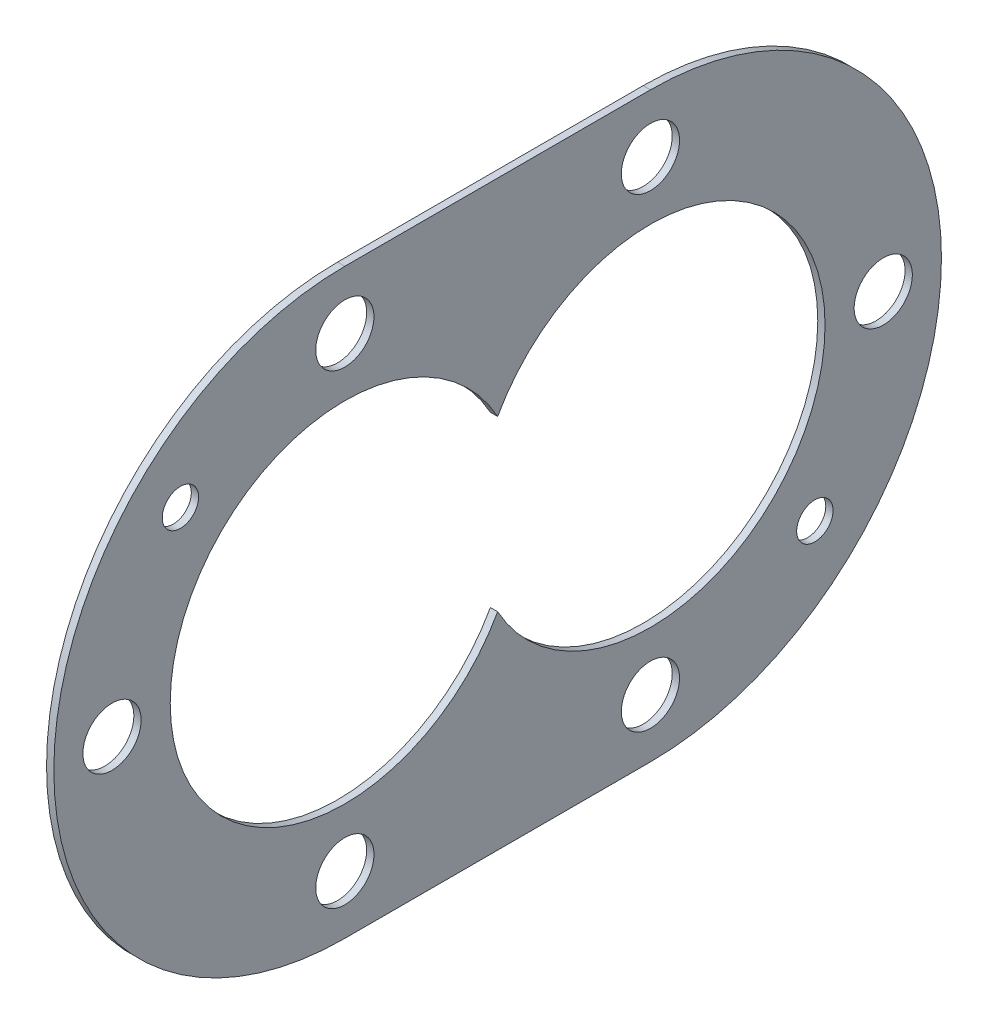
ISO-10303-21;
HEADER;
FILE_DESCRIPTION(('STEP AP214'),'2;1');
FILE_NAME('part.step','',(''),(''),'','','');
FILE_SCHEMA(('AUTOMOTIVE_DESIGN { 1 0 10303 214 1 1 1 1 }'));
ENDSEC;
DATA;
#1=APPLICATION_CONTEXT('core data for automotive mechanical design processes');
#2=APPLICATION_PROTOCOL_DEFINITION('international standard','automotive_design',2000,#1);
#3=PRODUCT_CONTEXT('',#1,'mechanical');
#4=PRODUCT('Part','Part','',(#3));
#5=PRODUCT_RELATED_PRODUCT_CATEGORY('part','',(#4));
#6=PRODUCT_DEFINITION_FORMATION('','',#4);
#7=PRODUCT_DEFINITION_CONTEXT('part definition',#1,'design');
#8=PRODUCT_DEFINITION('design','',#6,#7);
#9=PRODUCT_DEFINITION_SHAPE('','',#8);
#10=(LENGTH_UNIT() NAMED_UNIT(*) SI_UNIT(.MILLI.,.METRE.));
#11=(NAMED_UNIT(*) PLANE_ANGLE_UNIT() SI_UNIT($,.RADIAN.));
#12=(NAMED_UNIT(*) SI_UNIT($,.STERADIAN.) SOLID_ANGLE_UNIT());
#13=UNCERTAINTY_MEASURE_WITH_UNIT(LENGTH_MEASURE(1.E-05),#10,'distance_accuracy_value','');
#14=(GEOMETRIC_REPRESENTATION_CONTEXT(3) GLOBAL_UNCERTAINTY_ASSIGNED_CONTEXT((#13)) GLOBAL_UNIT_ASSIGNED_CONTEXT((#10,
#11,#12)) REPRESENTATION_CONTEXT('',''));
#15=CARTESIAN_POINT('',(0.,0.,0.));
#16=DIRECTION('',(0.,0.,1.));
#17=DIRECTION('',(1.,0.,0.));
#18=AXIS2_PLACEMENT_3D('',#15,#16,#17);
#19=CARTESIAN_POINT('',(-29.,0.,104.));
#20=DIRECTION('',(-1.,0.,0.));
#21=DIRECTION('',(0.,0.,1.));
#22=AXIS2_PLACEMENT_3D('',#19,#20,#21);
#23=CYLINDRICAL_SURFACE('',#22,24.);
#24=CARTESIAN_POINT('',(-30.,0.,104.));
#25=DIRECTION('',(1.,0.,0.));
#26=DIRECTION('',(0.,0.,-1.));
#27=AXIS2_PLACEMENT_3D('',#24,#25,#26);
#28=CIRCLE('',#27,24.);
#29=CARTESIAN_POINT('',(-30.,-11.6189500386223,83.));
#30=VERTEX_POINT('',#29);
#31=CARTESIAN_POINT('',(-30.,11.6189500386223,83.));
#32=VERTEX_POINT('',#31);
#33=EDGE_CURVE('E117',#30,#32,#28,.F.);
#34=ORIENTED_EDGE('',*,*,#33,.F.);
#35=DIRECTION('',(-1.,0.,0.));
#36=VECTOR('',#35,1.);
#37=CARTESIAN_POINT('',(-30.5,-11.6189500386223,83.));
#38=LINE('',#37,#36);
#39=CARTESIAN_POINT('',(-31.,-11.6189500386223,83.));
#40=VERTEX_POINT('',#39);
#41=EDGE_CURVE('E11',#30,#40,#38,.T.);
#42=ORIENTED_EDGE('',*,*,#41,.T.);
#43=CARTESIAN_POINT('',(-31.,0.,104.));
#44=DIRECTION('',(1.,0.,0.));
#45=DIRECTION('',(0.,0.,-1.));
#46=AXIS2_PLACEMENT_3D('',#43,#44,#45);
#47=CIRCLE('',#46,24.);
#48=CARTESIAN_POINT('',(-31.,11.6189500386223,83.));
#49=VERTEX_POINT('',#48);
#50=EDGE_CURVE('E114',#40,#49,#47,.F.);
#51=ORIENTED_EDGE('',*,*,#50,.T.);
#52=DIRECTION('',(-1.,0.,0.));
#53=VECTOR('',#52,1.);
#54=CARTESIAN_POINT('',(-30.5,11.6189500386223,83.));
#55=LINE('',#54,#53);
#56=EDGE_CURVE('E48',#49,#32,#55,.F.);
#57=ORIENTED_EDGE('',*,*,#56,.T.);
#58=EDGE_LOOP('',(#34,#42,#51,#57));
#59=FACE_BOUND('',#58,.T.);
#60=ADVANCED_FACE('F39',(#59),#23,.F.);
#61=CARTESIAN_POINT('',(-30.,0.,104.));
#62=DIRECTION('',(-1.,0.,0.));
#63=DIRECTION('',(0.,0.,1.));
#64=AXIS2_PLACEMENT_3D('',#61,#62,#63);
#65=CYLINDRICAL_SURFACE('',#64,40.);
#66=CARTESIAN_POINT('',(-31.,0.,104.));
#67=DIRECTION('',(1.,0.,0.));
#68=DIRECTION('',(0.,0.,-1.));
#69=AXIS2_PLACEMENT_3D('',#66,#67,#68);
#70=CIRCLE('',#69,40.);
#71=CARTESIAN_POINT('',(-31.,40.,104.));
#72=VERTEX_POINT('',#71);
#73=CARTESIAN_POINT('',(-31.,-40.,104.));
#74=VERTEX_POINT('',#73);
#75=EDGE_CURVE('E119',#72,#74,#70,.T.);
#76=ORIENTED_EDGE('',*,*,#75,.T.);
#77=DIRECTION('',(-1.,0.,0.));
#78=VECTOR('',#77,1.);
#79=CARTESIAN_POINT('',(-30.,-40.,104.));
#80=LINE('',#79,#78);
#81=CARTESIAN_POINT('',(-30.,-40.,104.));
#82=VERTEX_POINT('',#81);
#83=EDGE_CURVE('E108',#82,#74,#80,.T.);
#84=ORIENTED_EDGE('',*,*,#83,.F.);
#85=CARTESIAN_POINT('',(-30.,0.,104.));
#86=DIRECTION('',(1.,0.,0.));
#87=DIRECTION('',(0.,0.,-1.));
#88=AXIS2_PLACEMENT_3D('',#85,#86,#87);
#89=CIRCLE('',#88,40.);
#90=CARTESIAN_POINT('',(-30.,40.,104.));
#91=VERTEX_POINT('',#90);
#92=EDGE_CURVE('E173',#91,#82,#89,.T.);
#93=ORIENTED_EDGE('',*,*,#92,.F.);
#94=DIRECTION('',(-1.,0.,0.));
#95=VECTOR('',#94,1.);
#96=CARTESIAN_POINT('',(-30.,40.,104.));
#97=LINE('',#96,#95);
#98=EDGE_CURVE('E179',#91,#72,#97,.T.);
#99=ORIENTED_EDGE('',*,*,#98,.T.);
#100=EDGE_LOOP('',(#76,#84,#93,#99));
#101=FACE_BOUND('',#100,.T.);
#102=ADVANCED_FACE('F41',(#101),#65,.T.);
#103=CARTESIAN_POINT('',(-30.,-40.,104.));
#104=DIRECTION('',(0.,1.,0.));
#105=DIRECTION('',(0.,0.,1.));
#106=AXIS2_PLACEMENT_3D('',#103,#104,#105);
#107=PLANE('',#106);
#108=DIRECTION('',(0.,0.,-1.));
#109=VECTOR('',#108,1.);
#110=CARTESIAN_POINT('',(-31.,-40.,104.));
#111=LINE('',#110,#109);
#112=CARTESIAN_POINT('',(-31.,-40.,62.));
#113=VERTEX_POINT('',#112);
#114=EDGE_CURVE('E182',#74,#113,#111,.T.);
#115=ORIENTED_EDGE('',*,*,#114,.T.);
#116=DIRECTION('',(-1.,0.,0.));
#117=VECTOR('',#116,1.);
#118=CARTESIAN_POINT('',(-30.,-40.,62.));
#119=LINE('',#118,#117);
#120=CARTESIAN_POINT('',(-30.,-40.,62.));
#121=VERTEX_POINT('',#120);
#122=EDGE_CURVE('E189',#121,#113,#119,.T.);
#123=ORIENTED_EDGE('',*,*,#122,.F.);
#124=DIRECTION('',(0.,0.,-1.));
#125=VECTOR('',#124,1.);
#126=CARTESIAN_POINT('',(-30.,-40.,104.));
#127=LINE('',#126,#125);
#128=EDGE_CURVE('E94',#82,#121,#127,.T.);
#129=ORIENTED_EDGE('',*,*,#128,.F.);
#130=ORIENTED_EDGE('',*,*,#83,.T.);
#131=EDGE_LOOP('',(#115,#123,#129,#130));
#132=FACE_BOUND('',#131,.T.);
#133=ADVANCED_FACE('F195',(#132),#107,.F.);
#134=CARTESIAN_POINT('',(-30.,0.,62.));
#135=DIRECTION('',(-1.,0.,0.));
#136=DIRECTION('',(0.,0.,1.));
#137=AXIS2_PLACEMENT_3D('',#134,#135,#136);
#138=CYLINDRICAL_SURFACE('',#137,40.);
#139=CARTESIAN_POINT('',(-31.,0.,62.));
#140=DIRECTION('',(1.,0.,0.));
#141=DIRECTION('',(0.,0.,-1.));
#142=AXIS2_PLACEMENT_3D('',#139,#140,#141);
#143=CIRCLE('',#142,40.);
#144=CARTESIAN_POINT('',(-31.,40.,62.));
#145=VERTEX_POINT('',#144);
#146=EDGE_CURVE('E184',#113,#145,#143,.T.);
#147=ORIENTED_EDGE('',*,*,#146,.T.);
#148=DIRECTION('',(-1.,0.,0.));
#149=VECTOR('',#148,1.);
#150=CARTESIAN_POINT('',(-30.,40.,62.));
#151=LINE('',#150,#149);
#152=CARTESIAN_POINT('',(-30.,40.,62.));
#153=VERTEX_POINT('',#152);
#154=EDGE_CURVE('E188',#153,#145,#151,.T.);
#155=ORIENTED_EDGE('',*,*,#154,.F.);
#156=CARTESIAN_POINT('',(-30.,0.,62.));
#157=DIRECTION('',(1.,0.,0.));
#158=DIRECTION('',(0.,0.,-1.));
#159=AXIS2_PLACEMENT_3D('',#156,#157,#158);
#160=CIRCLE('',#159,40.);
#161=EDGE_CURVE('E176',#121,#153,#160,.T.);
#162=ORIENTED_EDGE('',*,*,#161,.F.);
#163=ORIENTED_EDGE('',*,*,#122,.T.);
#164=EDGE_LOOP('',(#147,#155,#162,#163));
#165=FACE_BOUND('',#164,.T.);
#166=ADVANCED_FACE('F200',(#165),#138,.T.);
#167=CARTESIAN_POINT('',(-30.,40.,62.));
#168=DIRECTION('',(0.,-1.,0.));
#169=DIRECTION('',(0.,0.,-1.));
#170=AXIS2_PLACEMENT_3D('',#167,#168,#169);
#171=PLANE('',#170);
#172=DIRECTION('',(0.,0.,1.));
#173=VECTOR('',#172,1.);
#174=CARTESIAN_POINT('',(-31.,40.,62.));
#175=LINE('',#174,#173);
#176=EDGE_CURVE('E86',#145,#72,#175,.T.);
#177=ORIENTED_EDGE('',*,*,#176,.T.);
#178=ORIENTED_EDGE('',*,*,#98,.F.);
#179=DIRECTION('',(0.,0.,1.));
#180=VECTOR('',#179,1.);
#181=CARTESIAN_POINT('',(-30.,40.,62.));
#182=LINE('',#181,#180);
#183=EDGE_CURVE('E65',#153,#91,#182,.T.);
#184=ORIENTED_EDGE('',*,*,#183,.F.);
#185=ORIENTED_EDGE('',*,*,#154,.T.);
#186=EDGE_LOOP('',(#177,#178,#184,#185));
#187=FACE_BOUND('',#186,.T.);
#188=ADVANCED_FACE('F201',(#187),#171,.F.);
#189=CARTESIAN_POINT('',(-30.,0.,104.));
#190=DIRECTION('',(1.,0.,0.));
#191=DIRECTION('',(0.,0.,-1.));
#192=AXIS2_PLACEMENT_3D('',#189,#190,#191);
#193=PLANE('',#192);
#194=CARTESIAN_POINT('',(-30.,-22.6,39.4));
#195=DIRECTION('',(1.,0.,0.));
#196=DIRECTION('',(0.,0.,-1.));
#197=AXIS2_PLACEMENT_3D('',#194,#195,#196);
#198=CIRCLE('',#197,2.5);
#199=CARTESIAN_POINT('',(-30.,-22.6,36.9));
#200=VERTEX_POINT('',#199);
#201=EDGE_CURVE('E150',#200,#200,#198,.F.);
#202=ORIENTED_EDGE('',*,*,#201,.T.);
#203=EDGE_LOOP('',(#202));
#204=FACE_BOUND('',#203,.T.);
#205=CARTESIAN_POINT('',(-30.,22.6,126.6));
#206=DIRECTION('',(1.,0.,0.));
#207=DIRECTION('',(0.,0.,-1.));
#208=AXIS2_PLACEMENT_3D('',#205,#206,#207);
#209=CIRCLE('',#208,2.5);
#210=CARTESIAN_POINT('',(-30.,22.6,124.1));
#211=VERTEX_POINT('',#210);
#212=EDGE_CURVE('E147',#211,#211,#209,.F.);
#213=ORIENTED_EDGE('',*,*,#212,.T.);
#214=EDGE_LOOP('',(#213));
#215=FACE_BOUND('',#214,.T.);
#216=CARTESIAN_POINT('',(-30.,0.,30.));
#217=DIRECTION('',(1.,0.,0.));
#218=DIRECTION('',(0.,0.,-1.));
#219=AXIS2_PLACEMENT_3D('',#216,#217,#218);
#220=CIRCLE('',#219,4.);
#221=CARTESIAN_POINT('',(-30.,0.,26.));
#222=VERTEX_POINT('',#221);
#223=EDGE_CURVE('E144',#222,#222,#220,.F.);
#224=ORIENTED_EDGE('',*,*,#223,.T.);
#225=EDGE_LOOP('',(#224));
#226=FACE_BOUND('',#225,.T.);
#227=CARTESIAN_POINT('',(-30.,0.,136.));
#228=DIRECTION('',(1.,0.,0.));
#229=DIRECTION('',(0.,0.,-1.));
#230=AXIS2_PLACEMENT_3D('',#227,#228,#229);
#231=CIRCLE('',#230,4.);
#232=CARTESIAN_POINT('',(-30.,0.,132.));
#233=VERTEX_POINT('',#232);
#234=EDGE_CURVE('E140',#233,#233,#231,.F.);
#235=ORIENTED_EDGE('',*,*,#234,.T.);
#236=EDGE_LOOP('',(#235));
#237=FACE_BOUND('',#236,.T.);
#238=CARTESIAN_POINT('',(-30.,-32.,62.));
#239=DIRECTION('',(1.,0.,0.));
#240=DIRECTION('',(0.,0.,-1.));
#241=AXIS2_PLACEMENT_3D('',#238,#239,#240);
#242=CIRCLE('',#241,4.);
#243=CARTESIAN_POINT('',(-30.,-32.,58.));
#244=VERTEX_POINT('',#243);
#245=EDGE_CURVE('E136',#244,#244,#242,.F.);
#246=ORIENTED_EDGE('',*,*,#245,.T.);
#247=EDGE_LOOP('',(#246));
#248=FACE_BOUND('',#247,.T.);
#249=CARTESIAN_POINT('',(-30.,32.,62.));
#250=DIRECTION('',(1.,0.,0.));
#251=DIRECTION('',(0.,0.,-1.));
#252=AXIS2_PLACEMENT_3D('',#249,#250,#251);
#253=CIRCLE('',#252,4.);
#254=CARTESIAN_POINT('',(-30.,32.,58.));
#255=VERTEX_POINT('',#254);
#256=EDGE_CURVE('E132',#255,#255,#253,.F.);
#257=ORIENTED_EDGE('',*,*,#256,.T.);
#258=EDGE_LOOP('',(#257));
#259=FACE_BOUND('',#258,.T.);
#260=CARTESIAN_POINT('',(-30.,-32.,104.));
#261=DIRECTION('',(1.,0.,0.));
#262=DIRECTION('',(0.,0.,-1.));
#263=AXIS2_PLACEMENT_3D('',#260,#261,#262);
#264=CIRCLE('',#263,4.);
#265=CARTESIAN_POINT('',(-30.,-32.,100.));
#266=VERTEX_POINT('',#265);
#267=EDGE_CURVE('E128',#266,#266,#264,.F.);
#268=ORIENTED_EDGE('',*,*,#267,.T.);
#269=EDGE_LOOP('',(#268));
#270=FACE_BOUND('',#269,.T.);
#271=CARTESIAN_POINT('',(-30.,32.,104.));
#272=DIRECTION('',(1.,0.,0.));
#273=DIRECTION('',(0.,0.,-1.));
#274=AXIS2_PLACEMENT_3D('',#271,#272,#273);
#275=CIRCLE('',#274,4.);
#276=CARTESIAN_POINT('',(-30.,32.,100.));
#277=VERTEX_POINT('',#276);
#278=EDGE_CURVE('E115',#277,#277,#275,.F.);
#279=ORIENTED_EDGE('',*,*,#278,.T.);
#280=EDGE_LOOP('',(#279));
#281=FACE_BOUND('',#280,.T.);
#282=ORIENTED_EDGE('',*,*,#33,.T.);
#283=CARTESIAN_POINT('',(-30.,0.,62.));
#284=DIRECTION('',(1.,0.,0.));
#285=DIRECTION('',(0.,0.,-1.));
#286=AXIS2_PLACEMENT_3D('',#283,#284,#285);
#287=CIRCLE('',#286,24.);
#288=EDGE_CURVE('E56',#32,#30,#287,.F.);
#289=ORIENTED_EDGE('',*,*,#288,.T.);
#290=EDGE_LOOP('',(#282,#289));
#291=FACE_BOUND('',#290,.T.);
#292=ORIENTED_EDGE('',*,*,#92,.T.);
#293=ORIENTED_EDGE('',*,*,#128,.T.);
#294=ORIENTED_EDGE('',*,*,#161,.T.);
#295=ORIENTED_EDGE('',*,*,#183,.T.);
#296=EDGE_LOOP('',(#292,#293,#294,#295));
#297=FACE_BOUND('',#296,.T.);
#298=ADVANCED_FACE('F202',(#204,#215,#226,#237,#248,#259,#270,#281,#291,#297),#193,.T.);
#299=CARTESIAN_POINT('',(-31.,0.,104.));
#300=DIRECTION('',(1.,0.,0.));
#301=DIRECTION('',(0.,0.,-1.));
#302=AXIS2_PLACEMENT_3D('',#299,#300,#301);
#303=PLANE('',#302);
#304=CARTESIAN_POINT('',(-31.,-22.6,39.4));
#305=DIRECTION('',(1.,0.,0.));
#306=DIRECTION('',(0.,0.,-1.));
#307=AXIS2_PLACEMENT_3D('',#304,#305,#306);
#308=CIRCLE('',#307,2.5);
#309=CARTESIAN_POINT('',(-31.,-22.6,36.9));
#310=VERTEX_POINT('',#309);
#311=EDGE_CURVE('E43',#310,#310,#308,.F.);
#312=ORIENTED_EDGE('',*,*,#311,.F.);
#313=EDGE_LOOP('',(#312));
#314=FACE_BOUND('',#313,.T.);
#315=CARTESIAN_POINT('',(-31.,22.6,126.6));
#316=DIRECTION('',(1.,0.,0.));
#317=DIRECTION('',(0.,0.,-1.));
#318=AXIS2_PLACEMENT_3D('',#315,#316,#317);
#319=CIRCLE('',#318,2.5);
#320=CARTESIAN_POINT('',(-31.,22.6,124.1));
#321=VERTEX_POINT('',#320);
#322=EDGE_CURVE('E148',#321,#321,#319,.F.);
#323=ORIENTED_EDGE('',*,*,#322,.F.);
#324=EDGE_LOOP('',(#323));
#325=FACE_BOUND('',#324,.T.);
#326=CARTESIAN_POINT('',(-31.,0.,30.));
#327=DIRECTION('',(1.,0.,0.));
#328=DIRECTION('',(0.,0.,-1.));
#329=AXIS2_PLACEMENT_3D('',#326,#327,#328);
#330=CIRCLE('',#329,4.);
#331=CARTESIAN_POINT('',(-31.,0.,26.));
#332=VERTEX_POINT('',#331);
#333=EDGE_CURVE('E145',#332,#332,#330,.F.);
#334=ORIENTED_EDGE('',*,*,#333,.F.);
#335=EDGE_LOOP('',(#334));
#336=FACE_BOUND('',#335,.T.);
#337=CARTESIAN_POINT('',(-31.,0.,136.));
#338=DIRECTION('',(1.,0.,0.));
#339=DIRECTION('',(0.,0.,-1.));
#340=AXIS2_PLACEMENT_3D('',#337,#338,#339);
#341=CIRCLE('',#340,4.);
#342=CARTESIAN_POINT('',(-31.,0.,132.));
#343=VERTEX_POINT('',#342);
#344=EDGE_CURVE('E141',#343,#343,#341,.F.);
#345=ORIENTED_EDGE('',*,*,#344,.F.);
#346=EDGE_LOOP('',(#345));
#347=FACE_BOUND('',#346,.T.);
#348=CARTESIAN_POINT('',(-31.,-32.,62.));
#349=DIRECTION('',(1.,0.,0.));
#350=DIRECTION('',(0.,0.,-1.));
#351=AXIS2_PLACEMENT_3D('',#348,#349,#350);
#352=CIRCLE('',#351,4.);
#353=CARTESIAN_POINT('',(-31.,-32.,58.));
#354=VERTEX_POINT('',#353);
#355=EDGE_CURVE('E137',#354,#354,#352,.F.);
#356=ORIENTED_EDGE('',*,*,#355,.F.);
#357=EDGE_LOOP('',(#356));
#358=FACE_BOUND('',#357,.T.);
#359=CARTESIAN_POINT('',(-31.,32.,62.));
#360=DIRECTION('',(1.,0.,0.));
#361=DIRECTION('',(0.,0.,-1.));
#362=AXIS2_PLACEMENT_3D('',#359,#360,#361);
#363=CIRCLE('',#362,4.);
#364=CARTESIAN_POINT('',(-31.,32.,58.));
#365=VERTEX_POINT('',#364);
#366=EDGE_CURVE('E133',#365,#365,#363,.F.);
#367=ORIENTED_EDGE('',*,*,#366,.F.);
#368=EDGE_LOOP('',(#367));
#369=FACE_BOUND('',#368,.T.);
#370=CARTESIAN_POINT('',(-31.,-32.,104.));
#371=DIRECTION('',(1.,0.,0.));
#372=DIRECTION('',(0.,0.,-1.));
#373=AXIS2_PLACEMENT_3D('',#370,#371,#372);
#374=CIRCLE('',#373,4.);
#375=CARTESIAN_POINT('',(-31.,-32.,100.));
#376=VERTEX_POINT('',#375);
#377=EDGE_CURVE('E129',#376,#376,#374,.F.);
#378=ORIENTED_EDGE('',*,*,#377,.F.);
#379=EDGE_LOOP('',(#378));
#380=FACE_BOUND('',#379,.T.);
#381=CARTESIAN_POINT('',(-31.,32.,104.));
#382=DIRECTION('',(1.,0.,0.));
#383=DIRECTION('',(0.,0.,-1.));
#384=AXIS2_PLACEMENT_3D('',#381,#382,#383);
#385=CIRCLE('',#384,4.);
#386=CARTESIAN_POINT('',(-31.,32.,100.));
#387=VERTEX_POINT('',#386);
#388=EDGE_CURVE('E125',#387,#387,#385,.F.);
#389=ORIENTED_EDGE('',*,*,#388,.F.);
#390=EDGE_LOOP('',(#389));
#391=FACE_BOUND('',#390,.T.);
#392=CARTESIAN_POINT('',(-31.,0.,62.));
#393=DIRECTION('',(1.,0.,0.));
#394=DIRECTION('',(0.,0.,-1.));
#395=AXIS2_PLACEMENT_3D('',#392,#393,#394);
#396=CIRCLE('',#395,24.);
#397=EDGE_CURVE('E103',#49,#40,#396,.F.);
#398=ORIENTED_EDGE('',*,*,#397,.F.);
#399=ORIENTED_EDGE('',*,*,#50,.F.);
#400=EDGE_LOOP('',(#398,#399));
#401=FACE_BOUND('',#400,.T.);
#402=ORIENTED_EDGE('',*,*,#75,.F.);
#403=ORIENTED_EDGE('',*,*,#176,.F.);
#404=ORIENTED_EDGE('',*,*,#146,.F.);
#405=ORIENTED_EDGE('',*,*,#114,.F.);
#406=EDGE_LOOP('',(#402,#403,#404,#405));
#407=FACE_BOUND('',#406,.T.);
#408=ADVANCED_FACE('F112',(#314,#325,#336,#347,#358,#369,#380,#391,#401,#407),#303,.F.);
#409=CARTESIAN_POINT('',(-29.,0.,62.));
#410=DIRECTION('',(-1.,0.,0.));
#411=DIRECTION('',(0.,0.,1.));
#412=AXIS2_PLACEMENT_3D('',#409,#410,#411);
#413=CYLINDRICAL_SURFACE('',#412,24.);
#414=ORIENTED_EDGE('',*,*,#288,.F.);
#415=ORIENTED_EDGE('',*,*,#56,.F.);
#416=ORIENTED_EDGE('',*,*,#397,.T.);
#417=ORIENTED_EDGE('',*,*,#41,.F.);
#418=EDGE_LOOP('',(#414,#415,#416,#417));
#419=FACE_BOUND('',#418,.T.);
#420=ADVANCED_FACE('F102',(#419),#413,.F.);
#421=CARTESIAN_POINT('',(-29.,32.,104.));
#422=DIRECTION('',(-1.,0.,0.));
#423=DIRECTION('',(0.,0.,1.));
#424=AXIS2_PLACEMENT_3D('',#421,#422,#423);
#425=CYLINDRICAL_SURFACE('',#424,4.);
#426=ORIENTED_EDGE('',*,*,#278,.F.);
#427=EDGE_LOOP('',(#426));
#428=FACE_BOUND('',#427,.T.);
#429=ORIENTED_EDGE('',*,*,#388,.T.);
#430=EDGE_LOOP('',(#429));
#431=FACE_BOUND('',#430,.T.);
#432=ADVANCED_FACE('F221',(#428,#431),#425,.F.);
#433=CARTESIAN_POINT('',(-29.,-32.,104.));
#434=DIRECTION('',(-1.,0.,0.));
#435=DIRECTION('',(0.,0.,1.));
#436=AXIS2_PLACEMENT_3D('',#433,#434,#435);
#437=CYLINDRICAL_SURFACE('',#436,4.);
#438=ORIENTED_EDGE('',*,*,#267,.F.);
#439=EDGE_LOOP('',(#438));
#440=FACE_BOUND('',#439,.T.);
#441=ORIENTED_EDGE('',*,*,#377,.T.);
#442=EDGE_LOOP('',(#441));
#443=FACE_BOUND('',#442,.T.);
#444=ADVANCED_FACE('F224',(#440,#443),#437,.F.);
#445=CARTESIAN_POINT('',(-29.,32.,62.));
#446=DIRECTION('',(-1.,0.,0.));
#447=DIRECTION('',(0.,0.,1.));
#448=AXIS2_PLACEMENT_3D('',#445,#446,#447);
#449=CYLINDRICAL_SURFACE('',#448,4.);
#450=ORIENTED_EDGE('',*,*,#256,.F.);
#451=EDGE_LOOP('',(#450));
#452=FACE_BOUND('',#451,.T.);
#453=ORIENTED_EDGE('',*,*,#366,.T.);
#454=EDGE_LOOP('',(#453));
#455=FACE_BOUND('',#454,.T.);
#456=ADVANCED_FACE('F228',(#452,#455),#449,.F.);
#457=CARTESIAN_POINT('',(-29.,-32.,62.));
#458=DIRECTION('',(-1.,0.,0.));
#459=DIRECTION('',(0.,0.,1.));
#460=AXIS2_PLACEMENT_3D('',#457,#458,#459);
#461=CYLINDRICAL_SURFACE('',#460,4.);
#462=ORIENTED_EDGE('',*,*,#245,.F.);
#463=EDGE_LOOP('',(#462));
#464=FACE_BOUND('',#463,.T.);
#465=ORIENTED_EDGE('',*,*,#355,.T.);
#466=EDGE_LOOP('',(#465));
#467=FACE_BOUND('',#466,.T.);
#468=ADVANCED_FACE('F232',(#464,#467),#461,.F.);
#469=CARTESIAN_POINT('',(-29.,0.,136.));
#470=DIRECTION('',(-1.,0.,0.));
#471=DIRECTION('',(0.,0.,1.));
#472=AXIS2_PLACEMENT_3D('',#469,#470,#471);
#473=CYLINDRICAL_SURFACE('',#472,4.);
#474=ORIENTED_EDGE('',*,*,#234,.F.);
#475=EDGE_LOOP('',(#474));
#476=FACE_BOUND('',#475,.T.);
#477=ORIENTED_EDGE('',*,*,#344,.T.);
#478=EDGE_LOOP('',(#477));
#479=FACE_BOUND('',#478,.T.);
#480=ADVANCED_FACE('F236',(#476,#479),#473,.F.);
#481=CARTESIAN_POINT('',(-29.,0.,30.));
#482=DIRECTION('',(-1.,0.,0.));
#483=DIRECTION('',(0.,0.,1.));
#484=AXIS2_PLACEMENT_3D('',#481,#482,#483);
#485=CYLINDRICAL_SURFACE('',#484,4.);
#486=ORIENTED_EDGE('',*,*,#223,.F.);
#487=EDGE_LOOP('',(#486));
#488=FACE_BOUND('',#487,.T.);
#489=ORIENTED_EDGE('',*,*,#333,.T.);
#490=EDGE_LOOP('',(#489));
#491=FACE_BOUND('',#490,.T.);
#492=ADVANCED_FACE('F240',(#488,#491),#485,.F.);
#493=CARTESIAN_POINT('',(-29.,22.6,126.6));
#494=DIRECTION('',(-1.,0.,0.));
#495=DIRECTION('',(0.,0.,1.));
#496=AXIS2_PLACEMENT_3D('',#493,#494,#495);
#497=CYLINDRICAL_SURFACE('',#496,2.5);
#498=ORIENTED_EDGE('',*,*,#212,.F.);
#499=EDGE_LOOP('',(#498));
#500=FACE_BOUND('',#499,.T.);
#501=ORIENTED_EDGE('',*,*,#322,.T.);
#502=EDGE_LOOP('',(#501));
#503=FACE_BOUND('',#502,.T.);
#504=ADVANCED_FACE('F244',(#500,#503),#497,.F.);
#505=CARTESIAN_POINT('',(-29.,-22.6,39.4));
#506=DIRECTION('',(-1.,0.,0.));
#507=DIRECTION('',(0.,0.,1.));
#508=AXIS2_PLACEMENT_3D('',#505,#506,#507);
#509=CYLINDRICAL_SURFACE('',#508,2.5);
#510=ORIENTED_EDGE('',*,*,#201,.F.);
#511=EDGE_LOOP('',(#510));
#512=FACE_BOUND('',#511,.T.);
#513=ORIENTED_EDGE('',*,*,#311,.T.);
#514=EDGE_LOOP('',(#513));
#515=FACE_BOUND('',#514,.T.);
#516=ADVANCED_FACE('F248',(#512,#515),#509,.F.);
#517=CLOSED_SHELL('',(#60,#102,#133,#166,#188,#298,#408,#420,#432,#444,#456,#468,#480,#492,#504,#516));
#518=MANIFOLD_SOLID_BREP('B2',#517);
#519=ADVANCED_BREP_SHAPE_REPRESENTATION('',(#18,#518),#14);
#520=SHAPE_DEFINITION_REPRESENTATION(#9,#519);
ENDSEC;
END-ISO-10303-21;
